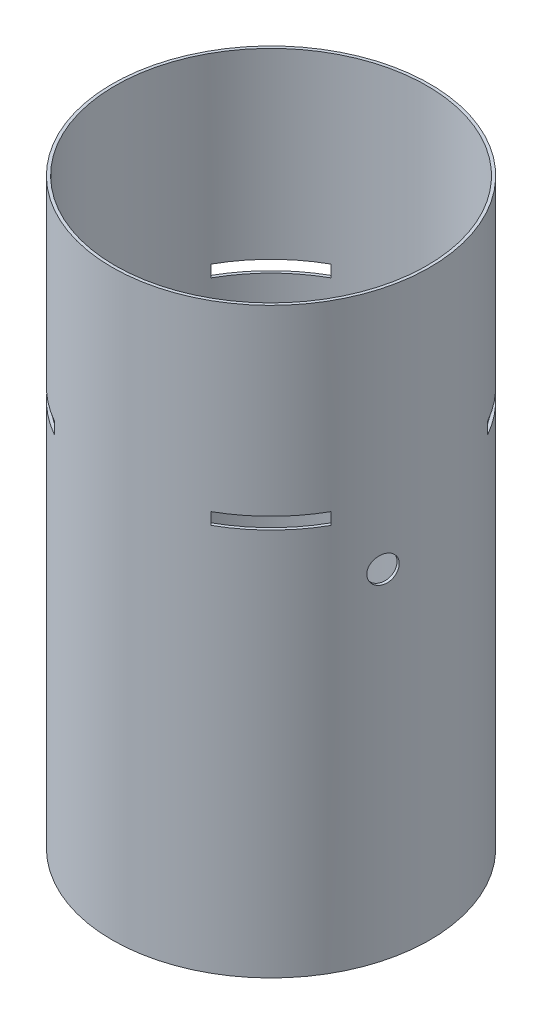
ISO-10303-21;
HEADER;
FILE_DESCRIPTION(('STEP AP214'),'2;1');
FILE_NAME('part.step','',(''),(''),'','','');
FILE_SCHEMA(('AUTOMOTIVE_DESIGN { 1 0 10303 214 1 1 1 1 }'));
ENDSEC;
DATA;
#1=APPLICATION_CONTEXT('core data for automotive mechanical design processes');
#2=APPLICATION_PROTOCOL_DEFINITION('international standard','automotive_design',2000,#1);
#3=PRODUCT_CONTEXT('',#1,'mechanical');
#4=PRODUCT('Part','Part','',(#3));
#5=PRODUCT_RELATED_PRODUCT_CATEGORY('part','',(#4));
#6=PRODUCT_DEFINITION_FORMATION('','',#4);
#7=PRODUCT_DEFINITION_CONTEXT('part definition',#1,'design');
#8=PRODUCT_DEFINITION('design','',#6,#7);
#9=PRODUCT_DEFINITION_SHAPE('','',#8);
#10=(LENGTH_UNIT() NAMED_UNIT(*) SI_UNIT(.MILLI.,.METRE.));
#11=(NAMED_UNIT(*) PLANE_ANGLE_UNIT() SI_UNIT($,.RADIAN.));
#12=(NAMED_UNIT(*) SI_UNIT($,.STERADIAN.) SOLID_ANGLE_UNIT());
#13=UNCERTAINTY_MEASURE_WITH_UNIT(LENGTH_MEASURE(1.E-05),#10,'distance_accuracy_value','');
#14=(GEOMETRIC_REPRESENTATION_CONTEXT(3) GLOBAL_UNCERTAINTY_ASSIGNED_CONTEXT((#13)) GLOBAL_UNIT_ASSIGNED_CONTEXT((#10,
#11,#12)) REPRESENTATION_CONTEXT('',''));
#15=CARTESIAN_POINT('',(0.,0.,0.));
#16=DIRECTION('',(0.,0.,1.));
#17=DIRECTION('',(1.,0.,0.));
#18=AXIS2_PLACEMENT_3D('',#15,#16,#17);
#19=CARTESIAN_POINT('',(0.,139.7,0.));
#20=DIRECTION('',(0.,1.,0.));
#21=DIRECTION('',(0.,0.,1.));
#22=AXIS2_PLACEMENT_3D('',#19,#20,#21);
#23=PLANE('',#22);
#24=CARTESIAN_POINT('',(0.,139.7,0.));
#25=DIRECTION('',(0.,1.,0.));
#26=DIRECTION('',(0.,0.,1.));
#27=AXIS2_PLACEMENT_3D('',#24,#25,#26);
#28=CIRCLE('',#27,76.2);
#29=CARTESIAN_POINT('',(0.,139.7,76.2));
#30=VERTEX_POINT('',#29);
#31=EDGE_CURVE('E293',#30,#30,#28,.T.);
#32=ORIENTED_EDGE('',*,*,#31,.T.);
#33=EDGE_LOOP('',(#32));
#34=FACE_BOUND('',#33,.T.);
#35=CARTESIAN_POINT('',(0.,139.7,0.));
#36=DIRECTION('',(0.,1.,0.));
#37=DIRECTION('',(0.,0.,1.));
#38=AXIS2_PLACEMENT_3D('',#35,#36,#37);
#39=CIRCLE('',#38,74.7776);
#40=CARTESIAN_POINT('',(0.,139.7,74.7776));
#41=VERTEX_POINT('',#40);
#42=EDGE_CURVE('E287',#41,#41,#39,.T.);
#43=ORIENTED_EDGE('',*,*,#42,.F.);
#44=EDGE_LOOP('',(#43));
#45=FACE_BOUND('',#44,.T.);
#46=ADVANCED_FACE('F35',(#34,#45),#23,.T.);
#47=CARTESIAN_POINT('',(0.,-139.7,0.));
#48=DIRECTION('',(0.,1.,0.));
#49=DIRECTION('',(0.,0.,1.));
#50=AXIS2_PLACEMENT_3D('',#47,#48,#49);
#51=PLANE('',#50);
#52=CARTESIAN_POINT('',(0.,-139.7,0.));
#53=DIRECTION('',(0.,1.,0.));
#54=DIRECTION('',(0.,0.,1.));
#55=AXIS2_PLACEMENT_3D('',#52,#53,#54);
#56=CIRCLE('',#55,76.2);
#57=CARTESIAN_POINT('',(0.,-139.7,76.2));
#58=VERTEX_POINT('',#57);
#59=EDGE_CURVE('E290',#58,#58,#56,.T.);
#60=ORIENTED_EDGE('',*,*,#59,.F.);
#61=EDGE_LOOP('',(#60));
#62=FACE_BOUND('',#61,.T.);
#63=CARTESIAN_POINT('',(0.,-139.7,0.));
#64=DIRECTION('',(0.,1.,0.));
#65=DIRECTION('',(0.,0.,1.));
#66=AXIS2_PLACEMENT_3D('',#63,#64,#65);
#67=CIRCLE('',#66,74.7776);
#68=CARTESIAN_POINT('',(0.,-139.7,74.7776));
#69=VERTEX_POINT('',#68);
#70=EDGE_CURVE('E286',#69,#69,#67,.T.);
#71=ORIENTED_EDGE('',*,*,#70,.T.);
#72=EDGE_LOOP('',(#71));
#73=FACE_BOUND('',#72,.T.);
#74=ADVANCED_FACE('F334',(#62,#73),#51,.F.);
#75=CARTESIAN_POINT('',(0.,139.7,0.));
#76=DIRECTION('',(0.,-1.,0.));
#77=DIRECTION('',(0.,0.,-1.));
#78=AXIS2_PLACEMENT_3D('',#75,#76,#77);
#79=CYLINDRICAL_SURFACE('',#78,76.2);
#80=CARTESIAN_POINT('',(74.9910357832042,22.86,13.519783732079));
#81=CARTESIAN_POINT('',(74.9910358402639,22.6819280297353,13.519782090402));
#82=CARTESIAN_POINT('',(74.9897026497337,22.5038810216355,13.5271842263217));
#83=CARTESIAN_POINT('',(74.9843661335385,22.1489977754155,13.556735220421));
#84=CARTESIAN_POINT('',(74.9803621484319,21.9721618472178,13.5788877205875));
#85=CARTESIAN_POINT('',(74.9696695475558,21.6208752943055,13.6377982342823));
#86=CARTESIAN_POINT('',(74.9629787143209,21.4464267631943,13.6745683114973));
#87=CARTESIAN_POINT('',(74.9468950412762,21.1012374874453,13.7624459317439));
#88=CARTESIAN_POINT('',(74.9375012129991,20.930498123836,13.8135587196397));
#89=CARTESIAN_POINT('',(74.916004850316,20.594164134536,13.9296696530872));
#90=CARTESIAN_POINT('',(74.9039048637211,20.4285648354645,13.9946547354603));
#91=CARTESIAN_POINT('',(74.8769675696476,20.1034526296558,14.1380709252443));
#92=CARTESIAN_POINT('',(74.8621292542587,19.9439419901768,14.2165069828681));
#93=CARTESIAN_POINT('',(74.8297111370588,19.6322869636413,14.3861663237595));
#94=CARTESIAN_POINT('',(74.8121329468327,19.4801383147924,14.4773820868793));
#95=CARTESIAN_POINT('',(74.7742106223098,19.1841204108037,14.6719887059059));
#96=CARTESIAN_POINT('',(74.7538654668784,19.0402542403011,14.7753840547336));
#97=CARTESIAN_POINT('',(74.7103707886967,18.7616054554387,14.9937623986853));
#98=CARTESIAN_POINT('',(74.6872159877024,18.6268407018144,15.1087671331046));
#99=CARTESIAN_POINT('',(74.6381354885443,18.3675971910905,15.3493911581652));
#100=CARTESIAN_POINT('',(74.6122087696292,18.2431222533158,15.4750143554367));
#101=CARTESIAN_POINT('',(74.5576297315973,18.0054305687499,15.7358696697887));
#102=CARTESIAN_POINT('',(74.5289783002773,17.8922101792993,15.8710986533934));
#103=CARTESIAN_POINT('',(74.4689832466984,17.6777424409017,16.1502607001277));
#104=CARTESIAN_POINT('',(74.43763863478,17.5764995260645,16.2941969571076));
#105=CARTESIAN_POINT('',(74.372308449198,17.3866517073631,16.5898363854602));
#106=CARTESIAN_POINT('',(74.3383200577136,17.2980605813446,16.7415477834206));
#107=CARTESIAN_POINT('',(74.2678284062168,17.1342501866457,17.051537881023));
#108=CARTESIAN_POINT('',(74.2313242202762,17.059035878112,17.2098189900045));
#109=CARTESIAN_POINT('',(74.1559637007638,16.9225865935057,17.5316948442234));
#110=CARTESIAN_POINT('',(74.1171082743897,16.8613462687066,17.6952875289043));
#111=CARTESIAN_POINT('',(74.0372132089691,16.7532330034018,18.0266528702492));
#112=CARTESIAN_POINT('',(73.9961727711386,16.7063653600969,18.1944270434701));
#113=CARTESIAN_POINT('',(73.8703063732629,16.5881307558746,18.7012874350092));
#114=CARTESIAN_POINT('',(73.7824754851912,16.5386610601558,19.0450262947247));
#115=CARTESIAN_POINT('',(73.6011471000854,16.499979528347,19.7341922847202));
#116=CARTESIAN_POINT('',(73.5076497084596,16.5107665717008,20.0796193834858));
#117=CARTESIAN_POINT('',(73.3179144353622,16.5921009666103,20.7617042350564));
#118=CARTESIAN_POINT('',(73.2216839333448,16.6624998970612,21.0983816289224));
#119=CARTESIAN_POINT('',(73.0294690776816,16.8608498757925,21.7543924115365));
#120=CARTESIAN_POINT('',(72.9334847263866,16.9888014716591,22.0737256352308));
#121=CARTESIAN_POINT('',(72.7451581891624,17.298784562556,22.686669790917));
#122=CARTESIAN_POINT('',(72.6528206401204,17.4808825459815,22.9802485206595));
#123=CARTESIAN_POINT('',(72.4755726348881,17.893942539743,23.5332921473863));
#124=CARTESIAN_POINT('',(72.3906623293987,18.1249055412399,23.7927563522301));
#125=CARTESIAN_POINT('',(72.2316085500085,18.6299757185528,24.2713546576644));
#126=CARTESIAN_POINT('',(72.157498586675,18.9042118985552,24.490363776588));
#127=CARTESIAN_POINT('',(72.0236655528563,19.4875944008328,24.8812060535303));
#128=CARTESIAN_POINT('',(71.9639424942308,19.7967407518855,25.0530391726601));
#129=CARTESIAN_POINT('',(71.8616603685797,20.4412588891374,25.3449365920436));
#130=CARTESIAN_POINT('',(71.8191034186302,20.7766339040018,25.4649945070476));
#131=CARTESIAN_POINT('',(71.7532158948204,21.4640459591348,25.650063226984));
#132=CARTESIAN_POINT('',(71.7298849167552,21.8160826489455,25.7150751891975));
#133=CARTESIAN_POINT('',(71.7036361325607,22.5256927347953,25.788177516094));
#134=CARTESIAN_POINT('',(71.7006572057165,22.8832463179772,25.7964383147106));
#135=CARTESIAN_POINT('',(71.7150972804281,23.5947352819856,25.7562664193095));
#136=CARTESIAN_POINT('',(71.7325160917262,23.9486706965291,25.7078342540892));
#137=CARTESIAN_POINT('',(71.7868558117002,24.6423583599151,25.5556994581878));
#138=CARTESIAN_POINT('',(71.8237486154484,24.982130289027,25.4520764771291));
#139=CARTESIAN_POINT('',(71.9152439197472,25.6384557195783,25.1923903985917));
#140=CARTESIAN_POINT('',(71.9698467044604,25.9550088483643,25.0363264596786));
#141=CARTESIAN_POINT('',(72.0943595527524,26.5567366596692,24.6754877803511));
#142=CARTESIAN_POINT('',(72.1643056687612,26.841835020504,24.4705982141134));
#143=CARTESIAN_POINT('',(72.3162750783604,27.3717888945838,24.017769329695));
#144=CARTESIAN_POINT('',(72.3982985797652,27.6166437152084,23.7698292707355));
#145=CARTESIAN_POINT('',(72.5711121217563,28.0597763895419,23.2368719605676));
#146=CARTESIAN_POINT('',(72.6619234378876,28.2579370034148,22.9517641155922));
#147=CARTESIAN_POINT('',(72.8484449967351,28.6012499292941,22.3526802366635));
#148=CARTESIAN_POINT('',(72.944155190486,28.7464027710057,22.0387044912255));
#149=CARTESIAN_POINT('',(73.1367094364613,28.9793853357991,21.3910202372047));
#150=CARTESIAN_POINT('',(73.2335518960764,29.0672875522433,21.0573372693717));
#151=CARTESIAN_POINT('',(73.4252055395191,29.1834849535822,20.3789857753476));
#152=CARTESIAN_POINT('',(73.520016761762,29.2117812667421,20.0343174572209));
#153=CARTESIAN_POINT('',(73.6582762908082,29.2089774600888,19.5174380912865));
#154=CARTESIAN_POINT('',(73.7036606610809,29.2005318712803,19.3453342619561));
#155=CARTESIAN_POINT('',(73.7928893357992,29.1687284383355,19.0021263984078));
#156=CARTESIAN_POINT('',(73.8367342045398,29.1453761196605,18.8310220174309));
#157=CARTESIAN_POINT('',(73.9226267344647,29.0839103678561,18.4909722343648));
#158=CARTESIAN_POINT('',(73.9646737283076,29.0457915055453,18.3220276499908));
#159=CARTESIAN_POINT('',(74.0467084474198,28.9550886954563,17.9876232219216));
#160=CARTESIAN_POINT('',(74.0866969216768,28.9025100536352,17.8221621239051));
#161=CARTESIAN_POINT('',(74.1644446475905,28.7832408128637,17.4958081379207));
#162=CARTESIAN_POINT('',(74.2022032151661,28.7165459118576,17.3349166595776));
#163=CARTESIAN_POINT('',(74.2753040532381,28.569558528556,17.0189744644724));
#164=CARTESIAN_POINT('',(74.31064720315,28.4892710325313,16.8639216312832));
#165=CARTESIAN_POINT('',(74.3788179631479,28.3156224519297,16.5606643590948));
#166=CARTESIAN_POINT('',(74.4116446963646,28.2222568419132,16.4124623143949));
#167=CARTESIAN_POINT('',(74.4746629017555,28.023170814566,16.1240926630279));
#168=CARTESIAN_POINT('',(74.5048553302727,27.917454913689,15.9839221470376));
#169=CARTESIAN_POINT('',(74.5626463373845,27.6940208928383,15.7121335507389));
#170=CARTESIAN_POINT('',(74.590236126478,27.5762647177504,15.5805448840502));
#171=CARTESIAN_POINT('',(74.642658004102,27.3299156122461,15.3274364381208));
#172=CARTESIAN_POINT('',(74.6674910987217,27.2013266657181,15.2059129895946));
#173=CARTESIAN_POINT('',(74.7144037267937,26.9340985290884,14.9737075905332));
#174=CARTESIAN_POINT('',(74.7364815680302,26.7954532444476,14.8630323115707));
#175=CARTESIAN_POINT('',(74.7778524865882,26.5092121104347,14.6534700592166));
#176=CARTESIAN_POINT('',(74.7971465886721,26.3616195833229,14.5545787502033));
#177=CARTESIAN_POINT('',(74.8330061259466,26.0581360896982,14.3690689911376));
#178=CARTESIAN_POINT('',(74.8495653288949,25.9022272122648,14.282478633365));
#179=CARTESIAN_POINT('',(74.879910628823,25.5835817381058,14.122521444593));
#180=CARTESIAN_POINT('',(74.893697740408,25.4208476659039,14.0491497764842));
#181=CARTESIAN_POINT('',(74.9185141870202,25.0897900518794,13.9162066025271));
#182=CARTESIAN_POINT('',(74.9295458394191,24.9214713426958,13.8566235034604));
#183=CARTESIAN_POINT('',(74.9488822600071,24.5803719107329,13.7516504456804));
#184=CARTESIAN_POINT('',(74.9571877124237,24.407592319316,13.7062569257731));
#185=CARTESIAN_POINT('',(74.9731163728553,24.00797384197,13.6188974874778));
#186=CARTESIAN_POINT('',(74.9798389019519,23.7800250067888,13.5817666486964));
#187=CARTESIAN_POINT('',(74.9887985641436,23.3213701480312,13.5322108674597));
#188=CARTESIAN_POINT('',(74.9910357092923,23.0906641318659,13.5197858586125));
#189=CARTESIAN_POINT('',(74.9910357832042,22.86,13.519783732079));
#190=B_SPLINE_CURVE_WITH_KNOTS('',3,(#80,#81,#82,#83,#84,#85,#86,#87,#88,#89,#90,#91,#92,#93,
#94,#95,#96,#97,#98,#99,#100,#101,#102,#103,#104,#105,#106,#107,#108,#109,#110,#111,#112,#113,
#114,#115,#116,#117,#118,#119,#120,#121,#122,#123,#124,#125,#126,#127,#128,#129,#130,#131,#132,
#133,#134,#135,#136,#137,#138,#139,#140,#141,#142,#143,#144,#145,#146,#147,#148,#149,#150,#151,
#152,#153,#154,#155,#156,#157,#158,#159,#160,#161,#162,#163,#164,#165,#166,#167,#168,#169,#170,
#171,#172,#173,#174,#175,#176,#177,#178,#179,#180,#181,#182,#183,#184,#185,#186,#187,#188,#189),
.UNSPECIFIED.,.T.,.F.,(4,2,2,2,2,2,2,2,2,2,2,2,2,2,2,2,2,2,2,2,2,2,2,2,2,2,2,2,2,2,2,2,2,2,2,2,
2,2,2,2,2,2,2,2,2,2,2,2,2,2,2,2,2,2,4),(0.,0.534014265780221,1.06816043301738,1.60274834198872,
2.1375319952038,2.67181426072716,3.20629357583423,3.74045969025397,4.27482347366641,
4.81020713221177,5.34578862789806,5.88119620838175,6.41680138275325,6.952985456639,
7.48936793584652,8.02554476190678,8.56191896465659,9.63100107910715,10.7000633125863,
11.7664716051261,12.8328900442491,13.9006234249725,14.9683784653054,16.0393789786569,
17.1103803748706,18.1815138160877,19.2526247373339,20.3205175085078,21.3884003191083,
22.4547461546914,23.5211091010023,24.5900050587395,25.6589194110182,26.7304896585072,
27.8020491975326,28.8722492271524,29.9424289990435,30.4764721128003,31.0103173882352,
31.5443591279187,32.0782051640344,32.6122141293487,33.1460276230515,33.6800262914724,
34.2138302863477,34.7493769070152,35.2847274263335,35.8204051446807,36.3558851610426,
36.892569068912,37.4290561876096,37.9650905838781,38.5009903420409,39.1927233972446,
39.884454593553),.UNSPECIFIED.);
#191=CARTESIAN_POINT('',(74.9910357832042,22.86,13.519783732079));
#192=VERTEX_POINT('',#191);
#193=EDGE_CURVE('E465',#192,#192,#190,.T.);
#194=ORIENTED_EDGE('',*,*,#193,.T.);
#195=EDGE_LOOP('',(#194));
#196=FACE_BOUND('',#195,.T.);
#197=DIRECTION('',(0.,-1.,0.));
#198=VECTOR('',#197,1.);
#199=CARTESIAN_POINT('',(37.5620128889523,139.7,66.2988324763731));
#200=LINE('',#199,#198);
#201=CARTESIAN_POINT('',(37.5620128889522,46.355,66.2988324763731));
#202=VERTEX_POINT('',#201);
#203=CARTESIAN_POINT('',(37.5620128889522,52.07,66.2988324763731));
#204=VERTEX_POINT('',#203);
#205=EDGE_CURVE('E256',#202,#204,#200,.F.);
#206=ORIENTED_EDGE('',*,*,#205,.T.);
#207=CARTESIAN_POINT('',(0.,52.07,0.));
#208=DIRECTION('',(0.,1.,0.));
#209=DIRECTION('',(0.,0.,1.));
#210=AXIS2_PLACEMENT_3D('',#207,#208,#209);
#211=CIRCLE('',#210,76.2);
#212=CARTESIAN_POINT('',(66.2988324763734,52.07,37.5620128889517));
#213=VERTEX_POINT('',#212);
#214=EDGE_CURVE('E232',#204,#213,#211,.T.);
#215=ORIENTED_EDGE('',*,*,#214,.T.);
#216=DIRECTION('',(0.,-1.,0.));
#217=VECTOR('',#216,1.);
#218=CARTESIAN_POINT('',(66.2988324763734,139.7,37.5620128889517));
#219=LINE('',#218,#217);
#220=CARTESIAN_POINT('',(66.2988324763734,46.355,37.5620128889517));
#221=VERTEX_POINT('',#220);
#222=EDGE_CURVE('E250',#213,#221,#219,.T.);
#223=ORIENTED_EDGE('',*,*,#222,.T.);
#224=CARTESIAN_POINT('',(0.,46.355,0.));
#225=DIRECTION('',(0.,-1.,0.));
#226=DIRECTION('',(0.,0.,-1.));
#227=AXIS2_PLACEMENT_3D('',#224,#225,#226);
#228=CIRCLE('',#227,76.2);
#229=EDGE_CURVE('E216',#221,#202,#228,.T.);
#230=ORIENTED_EDGE('',*,*,#229,.T.);
#231=EDGE_LOOP('',(#206,#215,#223,#230));
#232=FACE_BOUND('',#231,.T.);
#233=CARTESIAN_POINT('',(37.562012888952,46.355,-66.2988324763733));
#234=VERTEX_POINT('',#233);
#235=CARTESIAN_POINT('',(66.2988324763733,46.355,-37.562012888952));
#236=VERTEX_POINT('',#235);
#237=EDGE_CURVE('E255',#234,#236,#228,.T.);
#238=ORIENTED_EDGE('',*,*,#237,.T.);
#239=DIRECTION('',(0.,-1.,0.));
#240=VECTOR('',#239,1.);
#241=CARTESIAN_POINT('',(66.2988324763732,139.7,-37.5620128889521));
#242=LINE('',#241,#240);
#243=CARTESIAN_POINT('',(66.2988324763733,52.07,-37.562012888952));
#244=VERTEX_POINT('',#243);
#245=EDGE_CURVE('E247',#236,#244,#242,.F.);
#246=ORIENTED_EDGE('',*,*,#245,.T.);
#247=CARTESIAN_POINT('',(37.562012888952,52.07,-66.2988324763733));
#248=VERTEX_POINT('',#247);
#249=EDGE_CURVE('E262',#244,#248,#211,.T.);
#250=ORIENTED_EDGE('',*,*,#249,.T.);
#251=DIRECTION('',(0.,-1.,0.));
#252=VECTOR('',#251,1.);
#253=CARTESIAN_POINT('',(37.562012888952,139.7,-66.2988324763733));
#254=LINE('',#253,#252);
#255=EDGE_CURVE('E236',#248,#234,#254,.T.);
#256=ORIENTED_EDGE('',*,*,#255,.T.);
#257=EDGE_LOOP('',(#238,#246,#250,#256));
#258=FACE_BOUND('',#257,.T.);
#259=DIRECTION('',(0.,-1.,0.));
#260=VECTOR('',#259,1.);
#261=CARTESIAN_POINT('',(-37.5620128889528,139.7,-66.2988324763728));
#262=LINE('',#261,#260);
#263=CARTESIAN_POINT('',(-37.5620128889527,46.355,-66.2988324763729));
#264=VERTEX_POINT('',#263);
#265=CARTESIAN_POINT('',(-37.5620128889528,52.07,-66.2988324763728));
#266=VERTEX_POINT('',#265);
#267=EDGE_CURVE('E233',#264,#266,#262,.F.);
#268=ORIENTED_EDGE('',*,*,#267,.T.);
#269=CARTESIAN_POINT('',(-66.2988324763734,52.07,-37.5620128889517));
#270=VERTEX_POINT('',#269);
#271=EDGE_CURVE('E176',#266,#270,#211,.T.);
#272=ORIENTED_EDGE('',*,*,#271,.T.);
#273=DIRECTION('',(0.,-1.,0.));
#274=VECTOR('',#273,1.);
#275=CARTESIAN_POINT('',(-66.2988324763734,139.7,-37.5620128889518));
#276=LINE('',#275,#274);
#277=CARTESIAN_POINT('',(-66.2988324763734,46.355,-37.5620128889517));
#278=VERTEX_POINT('',#277);
#279=EDGE_CURVE('E258',#270,#278,#276,.T.);
#280=ORIENTED_EDGE('',*,*,#279,.T.);
#281=EDGE_CURVE('E252',#278,#264,#228,.T.);
#282=ORIENTED_EDGE('',*,*,#281,.T.);
#283=EDGE_LOOP('',(#268,#272,#280,#282));
#284=FACE_BOUND('',#283,.T.);
#285=DIRECTION('',(0.,-1.,0.));
#286=VECTOR('',#285,1.);
#287=CARTESIAN_POINT('',(-66.2988324763732,139.7,37.5620128889521));
#288=LINE('',#287,#286);
#289=CARTESIAN_POINT('',(-66.2988324763733,46.355,37.562012888952));
#290=VERTEX_POINT('',#289);
#291=CARTESIAN_POINT('',(-66.2988324763733,52.07,37.562012888952));
#292=VERTEX_POINT('',#291);
#293=EDGE_CURVE('E280',#290,#292,#288,.F.);
#294=ORIENTED_EDGE('',*,*,#293,.T.);
#295=CARTESIAN_POINT('',(0.,52.07,0.));
#296=DIRECTION('',(0.,1.,0.));
#297=DIRECTION('',(0.,0.,1.));
#298=AXIS2_PLACEMENT_3D('',#295,#296,#297);
#299=CIRCLE('',#298,76.2);
#300=CARTESIAN_POINT('',(-37.562012888952,52.07,66.2988324763733));
#301=VERTEX_POINT('',#300);
#302=EDGE_CURVE('E283',#292,#301,#299,.T.);
#303=ORIENTED_EDGE('',*,*,#302,.T.);
#304=DIRECTION('',(0.,-1.,0.));
#305=VECTOR('',#304,1.);
#306=CARTESIAN_POINT('',(-37.562012888952,139.7,66.2988324763733));
#307=LINE('',#306,#305);
#308=CARTESIAN_POINT('',(-37.562012888952,46.355,66.2988324763733));
#309=VERTEX_POINT('',#308);
#310=EDGE_CURVE('E266',#301,#309,#307,.T.);
#311=ORIENTED_EDGE('',*,*,#310,.T.);
#312=CARTESIAN_POINT('',(0.,46.355,0.));
#313=DIRECTION('',(0.,-1.,0.));
#314=DIRECTION('',(0.,0.,-1.));
#315=AXIS2_PLACEMENT_3D('',#312,#313,#314);
#316=CIRCLE('',#315,76.2);
#317=EDGE_CURVE('E277',#309,#290,#316,.T.);
#318=ORIENTED_EDGE('',*,*,#317,.T.);
#319=EDGE_LOOP('',(#294,#303,#311,#318));
#320=FACE_BOUND('',#319,.T.);
#321=ORIENTED_EDGE('',*,*,#31,.F.);
#322=EDGE_LOOP('',(#321));
#323=FACE_BOUND('',#322,.T.);
#324=ORIENTED_EDGE('',*,*,#59,.T.);
#325=EDGE_LOOP('',(#324));
#326=FACE_BOUND('',#325,.T.);
#327=ADVANCED_FACE('F37',(#196,#232,#258,#284,#320,#323,#326),#79,.T.);
#328=CARTESIAN_POINT('',(0.,139.7,0.));
#329=DIRECTION('',(0.,-1.,0.));
#330=DIRECTION('',(0.,0.,-1.));
#331=AXIS2_PLACEMENT_3D('',#328,#329,#330);
#332=CYLINDRICAL_SURFACE('',#331,74.7776);
#333=CARTESIAN_POINT('',(73.6122155851072,22.86,13.1503299734912));
#334=CARTESIAN_POINT('',(73.6122156358364,22.6819408457941,13.1503283168262));
#335=CARTESIAN_POINT('',(73.6108942584394,22.5039068059485,13.1577325077029));
#336=CARTESIAN_POINT('',(73.6056046626355,22.1490495890672,13.1872915474859));
#337=CARTESIAN_POINT('',(73.6016357921813,21.9722267211706,13.2094500302025));
#338=CARTESIAN_POINT('',(73.591035816007,21.6209668192102,13.2683760111798));
#339=CARTESIAN_POINT('',(73.5844025179281,21.4465318725149,13.3051555397513));
#340=CARTESIAN_POINT('',(73.5684547490499,21.1013696948546,13.3930549846881));
#341=CARTESIAN_POINT('',(73.55913929736,20.9306438449538,13.4441801472228));
#342=CARTESIAN_POINT('',(73.5378183099673,20.5943371551486,13.56031780622));
#343=CARTESIAN_POINT('',(73.525815314173,20.4287516244462,13.6253171879294));
#344=CARTESIAN_POINT('',(73.4990880260453,20.1036662104721,13.7687632828766));
#345=CARTESIAN_POINT('',(73.4843627316848,19.9441685942129,13.8472149468737));
#346=CARTESIAN_POINT('',(73.4521834549326,19.6325381547721,14.0169061017682));
#347=CARTESIAN_POINT('',(73.4347310732831,19.4804010792855,14.1081380876567));
#348=CARTESIAN_POINT('',(73.3970698191846,19.1844044959628,14.3027769577185));
#349=CARTESIAN_POINT('',(73.3768599289791,19.0405480724011,14.4061883351921));
#350=CARTESIAN_POINT('',(73.3336399219428,18.7619047305776,14.6246070477006));
#351=CARTESIAN_POINT('',(73.3106243069082,18.627136450831,14.7396370729655));
#352=CARTESIAN_POINT('',(73.2618235616743,18.3678846958092,14.9803119992035));
#353=CARTESIAN_POINT('',(73.2360374111875,18.2434050395244,15.1059608070283));
#354=CARTESIAN_POINT('',(73.1817368234827,18.0057024571114,15.3668670125669));
#355=CARTESIAN_POINT('',(73.1532232743664,17.8924758910492,15.5021212788606));
#356=CARTESIAN_POINT('',(73.0934975022423,17.6779942438523,15.7813329602421));
#357=CARTESIAN_POINT('',(73.06228428718,17.5767435961812,15.9252935687814));
#358=CARTESIAN_POINT('',(72.997204918337,17.3868733662181,16.2209886435832));
#359=CARTESIAN_POINT('',(72.9633357867989,17.2982682848962,16.3727317675674));
#360=CARTESIAN_POINT('',(72.8930686884779,17.1344301431286,16.6827839687296));
#361=CARTESIAN_POINT('',(72.8566697905013,17.0592020433269,16.8410954549525));
#362=CARTESIAN_POINT('',(72.7815027779843,16.9227257356352,17.163029853715));
#363=CARTESIAN_POINT('',(72.7427355783128,16.8614721721717,17.3266507039521));
#364=CARTESIAN_POINT('',(72.6629974690024,16.7533333339971,17.6580694476797));
#365=CARTESIAN_POINT('',(72.622025753482,16.7064533562136,17.8258688564743));
#366=CARTESIAN_POINT('',(72.4963402690409,16.5881908406485,18.3327688905404));
#367=CARTESIAN_POINT('',(72.4085902114106,16.5387022154505,18.6765155465485));
#368=CARTESIAN_POINT('',(72.2273302036263,16.4999793659019,19.3656764608318));
#369=CARTESIAN_POINT('',(72.1338203643116,16.5107439824175,19.7110906868991));
#370=CARTESIAN_POINT('',(71.9439784590771,16.5920264304235,20.3930953088721));
#371=CARTESIAN_POINT('',(71.8476542895407,16.6623901609027,20.7297061552738));
#372=CARTESIAN_POINT('',(71.6551730880771,16.8606547788512,21.385568765911));
#373=CARTESIAN_POINT('',(71.5590160578011,16.9885562315553,21.7048203595795));
#374=CARTESIAN_POINT('',(71.3702795096641,17.2984315867973,22.3176093333716));
#375=CARTESIAN_POINT('',(71.2777047255509,17.480474450186,22.6111132971368));
#376=CARTESIAN_POINT('',(71.0999476803173,17.8934165264475,23.1640103236372));
#377=CARTESIAN_POINT('',(71.0147655750484,18.1243167689732,23.4234026672946));
#378=CARTESIAN_POINT('',(70.8551523233984,18.6292873931068,23.9018996993602));
#379=CARTESIAN_POINT('',(70.7807559579695,18.903491729007,24.1208746470695));
#380=CARTESIAN_POINT('',(70.6463780368827,19.486820372507,24.5116619633362));
#381=CARTESIAN_POINT('',(70.5863964937806,19.7959447105235,24.6834742908124));
#382=CARTESIAN_POINT('',(70.4836535727135,20.4404335137737,24.9753499130401));
#383=CARTESIAN_POINT('',(70.4408944363552,20.7758013879923,25.0954064715885));
#384=CARTESIAN_POINT('',(70.3746822315108,21.4632118851678,25.2804926760576));
#385=CARTESIAN_POINT('',(70.3512287413334,21.8152541437302,25.3455235238999));
#386=CARTESIAN_POINT('',(70.3248300256171,22.5248444987398,25.4186797758822));
#387=CARTESIAN_POINT('',(70.3218210487955,22.8823719923968,25.4269820747747));
#388=CARTESIAN_POINT('',(70.336291535196,23.5938167395654,25.3869255841875));
#389=CARTESIAN_POINT('',(70.3537707998631,23.9477340280304,25.3385673438147));
#390=CARTESIAN_POINT('',(70.4083116443671,24.6413733294498,25.1866144296074));
#391=CARTESIAN_POINT('',(70.4453438813133,24.9811157922362,25.0831025220405));
#392=CARTESIAN_POINT('',(70.5371798258219,25.6373950487937,24.8236691263624));
#393=CARTESIAN_POINT('',(70.5919838292906,25.953931456068,24.6677467655966));
#394=CARTESIAN_POINT('',(70.7169428328694,26.5556704385707,24.3071967481621));
#395=CARTESIAN_POINT('',(70.7871353509309,26.8407938291173,24.1024499462006));
#396=CARTESIAN_POINT('',(70.9396093181463,27.3708124976505,23.6499080336364));
#397=CARTESIAN_POINT('',(71.0218909832411,27.6157070568893,23.4021121540606));
#398=CARTESIAN_POINT('',(71.1952123155935,28.0589570177752,22.869405825529));
#399=CARTESIAN_POINT('',(71.286274044547,28.257190639404,22.5844012112839));
#400=CARTESIAN_POINT('',(71.473251970724,28.6006539608336,21.9854942225347));
#401=CARTESIAN_POINT('',(71.5691681178271,28.7458842077503,21.6715921463603));
#402=CARTESIAN_POINT('',(71.7620615774351,28.9790161985061,21.0240334052114));
#403=CARTESIAN_POINT('',(71.8590373283924,29.0669930892152,20.6904032643126));
#404=CARTESIAN_POINT('',(72.0508737919754,29.1833410239278,20.012119119289));
#405=CARTESIAN_POINT('',(72.1457345462898,29.2117132438308,19.6674653327783));
#406=CARTESIAN_POINT('',(72.2839956305202,29.209021892386,19.1506001661169));
#407=CARTESIAN_POINT('',(72.3293659061061,29.2006153226223,18.978509863451));
#408=CARTESIAN_POINT('',(72.4185448032802,29.1688927851186,18.6353199387358));
#409=CARTESIAN_POINT('',(72.4623539972492,29.1455823426204,18.4642199732533));
#410=CARTESIAN_POINT('',(72.5481544492492,29.084203040033,18.1241700864652));
#411=CARTESIAN_POINT('',(72.5901450325634,29.0461287537276,17.9552209792807));
#412=CARTESIAN_POINT('',(72.6720477958642,28.9555176191279,17.6207987773778));
#413=CARTESIAN_POINT('',(72.7119607316632,28.9029860744799,17.4553244318564));
#414=CARTESIAN_POINT('',(72.7895400926744,28.7838137818592,17.1289365102435));
#415=CARTESIAN_POINT('',(72.8272058421305,28.7171688169473,16.9680243136033));
#416=CARTESIAN_POINT('',(72.9001067206689,28.5702836033914,16.6520325017303));
#417=CARTESIAN_POINT('',(72.9353427341493,28.4900483386212,16.4969507737164));
#418=CARTESIAN_POINT('',(73.0032879351814,28.3165061642789,16.1936277691653));
#419=CARTESIAN_POINT('',(73.03599624035,28.223194721713,16.0453888885649));
#420=CARTESIAN_POINT('',(73.0987697972487,28.0242184803415,15.7569381045524));
#421=CARTESIAN_POINT('',(73.1288360077192,27.9185581952766,15.6167232959299));
#422=CARTESIAN_POINT('',(73.1863732766275,27.695223718658,15.3448234898313));
#423=CARTESIAN_POINT('',(73.2138352243038,27.5775101447339,15.2131689102857));
#424=CARTESIAN_POINT('',(73.2660005118831,27.3312438951086,14.9599245628776));
#425=CARTESIAN_POINT('',(73.2907048579269,27.2026952029612,14.8383311283149));
#426=CARTESIAN_POINT('',(73.3373628275567,26.9355447172036,14.6059826501204));
#427=CARTESIAN_POINT('',(73.359314761352,26.7969368295775,14.4952342736513));
#428=CARTESIAN_POINT('',(73.4004406461651,26.5107669443623,14.2855238776985));
#429=CARTESIAN_POINT('',(73.4196156194975,26.3632082704598,14.1865575231632));
#430=CARTESIAN_POINT('',(73.4552480181452,26.0597797143671,14.0008914307963));
#431=CARTESIAN_POINT('',(73.4716990759403,25.9038914542154,13.9142205010123));
#432=CARTESIAN_POINT('',(73.5018415660837,25.5852818191489,13.7541043161671));
#433=CARTESIAN_POINT('',(73.5155340082128,25.4225629709967,13.6806542227217));
#434=CARTESIAN_POINT('',(73.540177623202,25.0915298937595,13.5475576835333));
#435=CARTESIAN_POINT('',(73.5511310946257,24.9232204916112,13.4878996665771));
#436=CARTESIAN_POINT('',(73.5703300458894,24.5821340966018,13.3827817338937));
#437=CARTESIAN_POINT('',(73.5785762039825,24.4093582344249,13.3373182622006));
#438=CARTESIAN_POINT('',(73.5944039991792,24.0094616090122,13.2497442682751));
#439=CARTESIAN_POINT('',(73.6010863330412,23.7812220842949,13.212501005713));
#440=CARTESIAN_POINT('',(73.6099920868379,23.3219742824879,13.1627949676003));
#441=CARTESIAN_POINT('',(73.6122155193047,23.0909660131817,13.1503321224024));
#442=CARTESIAN_POINT('',(73.6122155851072,22.86,13.1503299734912));
#443=B_SPLINE_CURVE_WITH_KNOTS('',3,(#333,#334,#335,#336,#337,#338,#339,#340,#341,#342,#343,
#344,#345,#346,#347,#348,#349,#350,#351,#352,#353,#354,#355,#356,#357,#358,#359,#360,#361,#362,
#363,#364,#365,#366,#367,#368,#369,#370,#371,#372,#373,#374,#375,#376,#377,#378,#379,#380,#381,
#382,#383,#384,#385,#386,#387,#388,#389,#390,#391,#392,#393,#394,#395,#396,#397,#398,#399,#400,
#401,#402,#403,#404,#405,#406,#407,#408,#409,#410,#411,#412,#413,#414,#415,#416,#417,#418,#419,
#420,#421,#422,#423,#424,#425,#426,#427,#428,#429,#430,#431,#432,#433,#434,#435,#436,#437,#438,
#439,#440,#441,#442),.UNSPECIFIED.,.T.,.F.,(4,2,2,2,2,2,2,2,2,2,2,2,2,2,2,2,2,2,2,2,2,2,2,2,2,2,
2,2,2,2,2,2,2,2,2,2,2,2,2,2,2,2,2,2,2,2,2,2,2,2,2,2,2,2,4),(0.,0.533975546842452,
1.06808265431217,1.6026301419189,2.13737336780301,2.67161334289403,3.20605035463319,
3.74017483350991,4.27449698599046,4.80988357631187,5.34546801029326,5.88087863596366,
6.41648685341004,6.95270441368053,7.48912040901263,8.0253304827207,8.56173792274051,
9.63079012708066,10.6998217653822,11.7660976960698,12.8323841017903,13.9000345142755,
14.9677074293787,16.038750155105,17.1097938137618,18.1809768306193,19.2521364491202,
20.3199543756194,21.3877619538007,22.453971622609,23.5201990451065,24.5890554779566,
25.6579310054421,26.7295659954395,27.8011899234018,28.871404458443,29.9415978797609,
30.4755855412168,31.0093753546631,31.543361540311,32.0771520936091,32.6111023634197,
33.1448572437228,33.6787976155774,34.2125434287153,34.7480924747605,35.2834454768119,
35.8191255557876,36.3546079246239,36.8913249037783,37.4278450613173,37.9639134447496,
38.4998474263165,39.1924855014101,39.8851216297844),.UNSPECIFIED.);
#444=CARTESIAN_POINT('',(73.6122155851072,22.86,13.1503299734912));
#445=VERTEX_POINT('',#444);
#446=EDGE_CURVE('E40',#445,#445,#443,.T.);
#447=ORIENTED_EDGE('',*,*,#446,.F.);
#448=EDGE_LOOP('',(#447));
#449=FACE_BOUND('',#448,.T.);
#450=CARTESIAN_POINT('',(0.,52.07,0.));
#451=DIRECTION('',(0.,1.,0.));
#452=DIRECTION('',(0.,0.,1.));
#453=AXIS2_PLACEMENT_3D('',#450,#451,#452);
#454=CIRCLE('',#453,74.7776);
#455=CARTESIAN_POINT('',(36.5176740689725,52.07,65.2544936563935));
#456=VERTEX_POINT('',#455);
#457=CARTESIAN_POINT('',(65.2544936563937,52.07,36.5176740689721));
#458=VERTEX_POINT('',#457);
#459=EDGE_CURVE('E11',#456,#458,#454,.T.);
#460=ORIENTED_EDGE('',*,*,#459,.F.);
#461=DIRECTION('',(0.,-1.,0.));
#462=VECTOR('',#461,1.);
#463=CARTESIAN_POINT('',(36.5176740689726,139.7,65.2544936563934));
#464=LINE('',#463,#462);
#465=CARTESIAN_POINT('',(36.5176740689725,46.355,65.2544936563934));
#466=VERTEX_POINT('',#465);
#467=EDGE_CURVE('E50',#466,#456,#464,.F.);
#468=ORIENTED_EDGE('',*,*,#467,.F.);
#469=CARTESIAN_POINT('',(0.,46.355,0.));
#470=DIRECTION('',(0.,-1.,0.));
#471=DIRECTION('',(0.,0.,-1.));
#472=AXIS2_PLACEMENT_3D('',#469,#470,#471);
#473=CIRCLE('',#472,74.7776);
#474=CARTESIAN_POINT('',(65.2544936563937,46.355,36.5176740689721));
#475=VERTEX_POINT('',#474);
#476=EDGE_CURVE('E198',#475,#466,#473,.T.);
#477=ORIENTED_EDGE('',*,*,#476,.F.);
#478=DIRECTION('',(0.,-1.,0.));
#479=VECTOR('',#478,1.);
#480=CARTESIAN_POINT('',(65.2544936563937,139.7,36.5176740689721));
#481=LINE('',#480,#479);
#482=EDGE_CURVE('E195',#458,#475,#481,.T.);
#483=ORIENTED_EDGE('',*,*,#482,.F.);
#484=EDGE_LOOP('',(#460,#468,#477,#483));
#485=FACE_BOUND('',#484,.T.);
#486=DIRECTION('',(0.,-1.,0.));
#487=VECTOR('',#486,1.);
#488=CARTESIAN_POINT('',(65.2544936563935,139.7,-36.5176740689724));
#489=LINE('',#488,#487);
#490=CARTESIAN_POINT('',(65.2544936563936,46.355,-36.5176740689723));
#491=VERTEX_POINT('',#490);
#492=CARTESIAN_POINT('',(65.2544936563936,52.07,-36.5176740689723));
#493=VERTEX_POINT('',#492);
#494=EDGE_CURVE('E189',#491,#493,#489,.F.);
#495=ORIENTED_EDGE('',*,*,#494,.F.);
#496=CARTESIAN_POINT('',(36.5176740689723,46.355,-65.2544936563936));
#497=VERTEX_POINT('',#496);
#498=EDGE_CURVE('E185',#497,#491,#473,.T.);
#499=ORIENTED_EDGE('',*,*,#498,.F.);
#500=DIRECTION('',(0.,-1.,0.));
#501=VECTOR('',#500,1.);
#502=CARTESIAN_POINT('',(36.5176740689723,139.7,-65.2544936563936));
#503=LINE('',#502,#501);
#504=CARTESIAN_POINT('',(36.5176740689723,52.07,-65.2544936563936));
#505=VERTEX_POINT('',#504);
#506=EDGE_CURVE('E184',#505,#497,#503,.T.);
#507=ORIENTED_EDGE('',*,*,#506,.F.);
#508=EDGE_CURVE('E52',#493,#505,#454,.T.);
#509=ORIENTED_EDGE('',*,*,#508,.F.);
#510=EDGE_LOOP('',(#495,#499,#507,#509));
#511=FACE_BOUND('',#510,.T.);
#512=CARTESIAN_POINT('',(-36.517674068973,52.07,-65.2544936563932));
#513=VERTEX_POINT('',#512);
#514=CARTESIAN_POINT('',(-65.2544936563937,52.07,-36.517674068972));
#515=VERTEX_POINT('',#514);
#516=EDGE_CURVE('E53',#513,#515,#454,.T.);
#517=ORIENTED_EDGE('',*,*,#516,.F.);
#518=DIRECTION('',(0.,-1.,0.));
#519=VECTOR('',#518,1.);
#520=CARTESIAN_POINT('',(-36.5176740689731,139.7,-65.2544936563932));
#521=LINE('',#520,#519);
#522=CARTESIAN_POINT('',(-36.5176740689731,46.355,-65.2544936563932));
#523=VERTEX_POINT('',#522);
#524=EDGE_CURVE('E157',#523,#513,#521,.F.);
#525=ORIENTED_EDGE('',*,*,#524,.F.);
#526=CARTESIAN_POINT('',(-65.2544936563937,46.355,-36.517674068972));
#527=VERTEX_POINT('',#526);
#528=EDGE_CURVE('E168',#527,#523,#473,.T.);
#529=ORIENTED_EDGE('',*,*,#528,.F.);
#530=DIRECTION('',(0.,-1.,0.));
#531=VECTOR('',#530,1.);
#532=CARTESIAN_POINT('',(-65.2544936563937,139.7,-36.5176740689721));
#533=LINE('',#532,#531);
#534=EDGE_CURVE('E183',#515,#527,#533,.T.);
#535=ORIENTED_EDGE('',*,*,#534,.F.);
#536=EDGE_LOOP('',(#517,#525,#529,#535));
#537=FACE_BOUND('',#536,.T.);
#538=CARTESIAN_POINT('',(0.,52.07,0.));
#539=DIRECTION('',(0.,1.,0.));
#540=DIRECTION('',(0.,0.,1.));
#541=AXIS2_PLACEMENT_3D('',#538,#539,#540);
#542=CIRCLE('',#541,74.7776);
#543=CARTESIAN_POINT('',(-65.2544936563936,52.07,36.5176740689723));
#544=VERTEX_POINT('',#543);
#545=CARTESIAN_POINT('',(-36.5176740689723,52.07,65.2544936563936));
#546=VERTEX_POINT('',#545);
#547=EDGE_CURVE('E169',#544,#546,#542,.T.);
#548=ORIENTED_EDGE('',*,*,#547,.F.);
#549=DIRECTION('',(0.,-1.,0.));
#550=VECTOR('',#549,1.);
#551=CARTESIAN_POINT('',(-65.2544936563935,139.7,36.5176740689724));
#552=LINE('',#551,#550);
#553=CARTESIAN_POINT('',(-65.2544936563936,46.355,36.5176740689723));
#554=VERTEX_POINT('',#553);
#555=EDGE_CURVE('E302',#554,#544,#552,.F.);
#556=ORIENTED_EDGE('',*,*,#555,.F.);
#557=CARTESIAN_POINT('',(0.,46.355,0.));
#558=DIRECTION('',(0.,-1.,0.));
#559=DIRECTION('',(0.,0.,-1.));
#560=AXIS2_PLACEMENT_3D('',#557,#558,#559);
#561=CIRCLE('',#560,74.7776);
#562=CARTESIAN_POINT('',(-36.5176740689723,46.355,65.2544936563936));
#563=VERTEX_POINT('',#562);
#564=EDGE_CURVE('E300',#563,#554,#561,.T.);
#565=ORIENTED_EDGE('',*,*,#564,.F.);
#566=DIRECTION('',(0.,-1.,0.));
#567=VECTOR('',#566,1.);
#568=CARTESIAN_POINT('',(-36.5176740689723,139.7,65.2544936563936));
#569=LINE('',#568,#567);
#570=EDGE_CURVE('E296',#546,#563,#569,.T.);
#571=ORIENTED_EDGE('',*,*,#570,.F.);
#572=EDGE_LOOP('',(#548,#556,#565,#571));
#573=FACE_BOUND('',#572,.T.);
#574=ORIENTED_EDGE('',*,*,#42,.T.);
#575=EDGE_LOOP('',(#574));
#576=FACE_BOUND('',#575,.T.);
#577=ORIENTED_EDGE('',*,*,#70,.F.);
#578=EDGE_LOOP('',(#577));
#579=FACE_BOUND('',#578,.T.);
#580=ADVANCED_FACE('F181',(#449,#485,#511,#537,#573,#576,#579),#332,.F.);
#581=CARTESIAN_POINT('',(-61.8315902062894,52.07,90.5684097937107));
#582=DIRECTION('',(0.,1.,0.));
#583=DIRECTION('',(0.,0.,1.));
#584=AXIS2_PLACEMENT_3D('',#581,#582,#583);
#585=PLANE('',#584);
#586=DIRECTION('',(0.707106781186547,0.,-0.707106781186548));
#587=VECTOR('',#586,1.);
#588=CARTESIAN_POINT('',(-90.5684097937107,52.07,61.8315902062894));
#589=LINE('',#588,#587);
#590=EDGE_CURVE('E263',#292,#544,#589,.T.);
#591=ORIENTED_EDGE('',*,*,#590,.T.);
#592=ORIENTED_EDGE('',*,*,#547,.T.);
#593=DIRECTION('',(0.707106781186547,0.,-0.707106781186548));
#594=VECTOR('',#593,1.);
#595=CARTESIAN_POINT('',(-61.8315902062894,52.07,90.5684097937107));
#596=LINE('',#595,#594);
#597=EDGE_CURVE('E273',#301,#546,#596,.T.);
#598=ORIENTED_EDGE('',*,*,#597,.F.);
#599=ORIENTED_EDGE('',*,*,#302,.F.);
#600=EDGE_LOOP('',(#591,#592,#598,#599));
#601=FACE_BOUND('',#600,.T.);
#602=ADVANCED_FACE('F309',(#601),#585,.F.);
#603=CARTESIAN_POINT('',(-90.5684097937107,52.07,61.8315902062894));
#604=DIRECTION('',(-0.707106781186548,0.,-0.707106781186547));
#605=DIRECTION('',(-0.707106781186547,0.,0.707106781186548));
#606=AXIS2_PLACEMENT_3D('',#603,#604,#605);
#607=PLANE('',#606);
#608=DIRECTION('',(0.707106781186547,0.,-0.707106781186548));
#609=VECTOR('',#608,1.);
#610=CARTESIAN_POINT('',(-90.5684097937107,46.355,61.8315902062894));
#611=LINE('',#610,#609);
#612=EDGE_CURVE('E267',#290,#554,#611,.T.);
#613=ORIENTED_EDGE('',*,*,#612,.T.);
#614=ORIENTED_EDGE('',*,*,#555,.T.);
#615=ORIENTED_EDGE('',*,*,#590,.F.);
#616=ORIENTED_EDGE('',*,*,#293,.F.);
#617=EDGE_LOOP('',(#613,#614,#615,#616));
#618=FACE_BOUND('',#617,.T.);
#619=ADVANCED_FACE('F323',(#618),#607,.F.);
#620=CARTESIAN_POINT('',(-90.5684097937107,46.355,61.8315902062894));
#621=DIRECTION('',(0.,-1.,0.));
#622=DIRECTION('',(0.,0.,-1.));
#623=AXIS2_PLACEMENT_3D('',#620,#621,#622);
#624=PLANE('',#623);
#625=DIRECTION('',(0.707106781186547,0.,-0.707106781186548));
#626=VECTOR('',#625,1.);
#627=CARTESIAN_POINT('',(-61.8315902062894,46.355,90.5684097937107));
#628=LINE('',#627,#626);
#629=EDGE_CURVE('E270',#309,#563,#628,.T.);
#630=ORIENTED_EDGE('',*,*,#629,.T.);
#631=ORIENTED_EDGE('',*,*,#564,.T.);
#632=ORIENTED_EDGE('',*,*,#612,.F.);
#633=ORIENTED_EDGE('',*,*,#317,.F.);
#634=EDGE_LOOP('',(#630,#631,#632,#633));
#635=FACE_BOUND('',#634,.T.);
#636=ADVANCED_FACE('F318',(#635),#624,.F.);
#637=CARTESIAN_POINT('',(-61.8315902062894,46.355,90.5684097937107));
#638=DIRECTION('',(0.707106781186548,0.,0.707106781186547));
#639=DIRECTION('',(0.707106781186547,0.,-0.707106781186548));
#640=AXIS2_PLACEMENT_3D('',#637,#638,#639);
#641=PLANE('',#640);
#642=ORIENTED_EDGE('',*,*,#597,.T.);
#643=ORIENTED_EDGE('',*,*,#570,.T.);
#644=ORIENTED_EDGE('',*,*,#629,.F.);
#645=ORIENTED_EDGE('',*,*,#310,.F.);
#646=EDGE_LOOP('',(#642,#643,#644,#645));
#647=FACE_BOUND('',#646,.T.);
#648=ADVANCED_FACE('F315',(#647),#641,.F.);
#649=CARTESIAN_POINT('',(-61.8315902062903,52.07,-90.56840979371));
#650=DIRECTION('',(0.70710678118654,0.,-0.707106781186555));
#651=DIRECTION('',(-0.707106781186555,0.,-0.70710678118654));
#652=AXIS2_PLACEMENT_3D('',#649,#650,#651);
#653=PLANE('',#652);
#654=DIRECTION('',(0.707106781186555,0.,0.70710678118654));
#655=VECTOR('',#654,1.);
#656=CARTESIAN_POINT('',(-61.8315902062903,46.355,-90.56840979371));
#657=LINE('',#656,#655);
#658=EDGE_CURVE('E163',#264,#523,#657,.T.);
#659=ORIENTED_EDGE('',*,*,#658,.T.);
#660=ORIENTED_EDGE('',*,*,#524,.T.);
#661=DIRECTION('',(0.707106781186555,0.,0.70710678118654));
#662=VECTOR('',#661,1.);
#663=CARTESIAN_POINT('',(-61.8315902062903,52.07,-90.56840979371));
#664=LINE('',#663,#662);
#665=EDGE_CURVE('E160',#266,#513,#664,.T.);
#666=ORIENTED_EDGE('',*,*,#665,.F.);
#667=ORIENTED_EDGE('',*,*,#267,.F.);
#668=EDGE_LOOP('',(#659,#660,#666,#667));
#669=FACE_BOUND('',#668,.T.);
#670=ADVANCED_FACE('F159',(#669),#653,.F.);
#671=CARTESIAN_POINT('',(61.8315902062897,46.355,90.5684097937104));
#672=DIRECTION('',(0.,-1.,0.));
#673=DIRECTION('',(0.,0.,-1.));
#674=AXIS2_PLACEMENT_3D('',#671,#672,#673);
#675=PLANE('',#674);
#676=DIRECTION('',(-0.70710678118655,0.,-0.707106781186545));
#677=VECTOR('',#676,1.);
#678=CARTESIAN_POINT('',(61.8315902062897,46.355,90.5684097937104));
#679=LINE('',#678,#677);
#680=EDGE_CURVE('E218',#527,#278,#679,.T.);
#681=ORIENTED_EDGE('',*,*,#680,.F.);
#682=ORIENTED_EDGE('',*,*,#528,.T.);
#683=ORIENTED_EDGE('',*,*,#658,.F.);
#684=ORIENTED_EDGE('',*,*,#281,.F.);
#685=EDGE_LOOP('',(#681,#682,#683,#684));
#686=FACE_BOUND('',#685,.T.);
#687=ADVANCED_FACE('F350',(#686),#675,.F.);
#688=CARTESIAN_POINT('',(61.8315902062897,52.07,90.5684097937104));
#689=DIRECTION('',(-0.707106781186545,0.,0.70710678118655));
#690=DIRECTION('',(0.70710678118655,0.,0.707106781186545));
#691=AXIS2_PLACEMENT_3D('',#688,#689,#690);
#692=PLANE('',#691);
#693=DIRECTION('',(-0.70710678118655,0.,-0.707106781186545));
#694=VECTOR('',#693,1.);
#695=CARTESIAN_POINT('',(61.8315902062897,52.07,90.5684097937104));
#696=LINE('',#695,#694);
#697=EDGE_CURVE('E234',#515,#270,#696,.T.);
#698=ORIENTED_EDGE('',*,*,#697,.F.);
#699=ORIENTED_EDGE('',*,*,#534,.T.);
#700=ORIENTED_EDGE('',*,*,#680,.T.);
#701=ORIENTED_EDGE('',*,*,#279,.F.);
#702=EDGE_LOOP('',(#698,#699,#700,#701));
#703=FACE_BOUND('',#702,.T.);
#704=ADVANCED_FACE('F355',(#703),#692,.F.);
#705=CARTESIAN_POINT('',(90.5684097937109,52.07,61.8315902062891));
#706=DIRECTION('',(0.,1.,0.));
#707=DIRECTION('',(0.,0.,1.));
#708=AXIS2_PLACEMENT_3D('',#705,#706,#707);
#709=PLANE('',#708);
#710=ORIENTED_EDGE('',*,*,#665,.T.);
#711=ORIENTED_EDGE('',*,*,#516,.T.);
#712=ORIENTED_EDGE('',*,*,#697,.T.);
#713=ORIENTED_EDGE('',*,*,#271,.F.);
#714=EDGE_LOOP('',(#710,#711,#712,#713));
#715=FACE_BOUND('',#714,.T.);
#716=ADVANCED_FACE('F172',(#715),#709,.F.);
#717=CARTESIAN_POINT('',(90.5684097937107,52.07,-61.8315902062894));
#718=DIRECTION('',(0.707106781186548,0.,0.707106781186547));
#719=DIRECTION('',(0.707106781186547,0.,-0.707106781186548));
#720=AXIS2_PLACEMENT_3D('',#717,#718,#719);
#721=PLANE('',#720);
#722=DIRECTION('',(-0.707106781186547,0.,0.707106781186548));
#723=VECTOR('',#722,1.);
#724=CARTESIAN_POINT('',(90.5684097937107,46.355,-61.8315902062894));
#725=LINE('',#724,#723);
#726=EDGE_CURVE('E473',#236,#491,#725,.T.);
#727=ORIENTED_EDGE('',*,*,#726,.T.);
#728=ORIENTED_EDGE('',*,*,#494,.T.);
#729=DIRECTION('',(-0.707106781186547,0.,0.707106781186548));
#730=VECTOR('',#729,1.);
#731=CARTESIAN_POINT('',(90.5684097937107,52.07,-61.8315902062894));
#732=LINE('',#731,#730);
#733=EDGE_CURVE('E243',#244,#493,#732,.T.);
#734=ORIENTED_EDGE('',*,*,#733,.F.);
#735=ORIENTED_EDGE('',*,*,#245,.F.);
#736=EDGE_LOOP('',(#727,#728,#734,#735));
#737=FACE_BOUND('',#736,.T.);
#738=ADVANCED_FACE('F362',(#737),#721,.F.);
#739=CARTESIAN_POINT('',(61.8315902062894,46.355,-90.5684097937107));
#740=DIRECTION('',(-0.707106781186548,0.,-0.707106781186547));
#741=DIRECTION('',(-0.707106781186547,0.,0.707106781186548));
#742=AXIS2_PLACEMENT_3D('',#739,#740,#741);
#743=PLANE('',#742);
#744=DIRECTION('',(-0.707106781186547,0.,0.707106781186548));
#745=VECTOR('',#744,1.);
#746=CARTESIAN_POINT('',(61.8315902062894,52.07,-90.5684097937107));
#747=LINE('',#746,#745);
#748=EDGE_CURVE('E178',#248,#505,#747,.T.);
#749=ORIENTED_EDGE('',*,*,#748,.T.);
#750=ORIENTED_EDGE('',*,*,#506,.T.);
#751=DIRECTION('',(-0.707106781186547,0.,0.707106781186548));
#752=VECTOR('',#751,1.);
#753=CARTESIAN_POINT('',(61.8315902062894,46.355,-90.5684097937107));
#754=LINE('',#753,#752);
#755=EDGE_CURVE('E68',#234,#497,#754,.T.);
#756=ORIENTED_EDGE('',*,*,#755,.F.);
#757=ORIENTED_EDGE('',*,*,#255,.F.);
#758=EDGE_LOOP('',(#749,#750,#756,#757));
#759=FACE_BOUND('',#758,.T.);
#760=ADVANCED_FACE('F365',(#759),#743,.F.);
#761=ORIENTED_EDGE('',*,*,#755,.T.);
#762=ORIENTED_EDGE('',*,*,#498,.T.);
#763=ORIENTED_EDGE('',*,*,#726,.F.);
#764=ORIENTED_EDGE('',*,*,#237,.F.);
#765=EDGE_LOOP('',(#761,#762,#763,#764));
#766=FACE_BOUND('',#765,.T.);
#767=ADVANCED_FACE('F358',(#766),#675,.F.);
#768=ORIENTED_EDGE('',*,*,#733,.T.);
#769=ORIENTED_EDGE('',*,*,#508,.T.);
#770=ORIENTED_EDGE('',*,*,#748,.F.);
#771=ORIENTED_EDGE('',*,*,#249,.F.);
#772=EDGE_LOOP('',(#768,#769,#770,#771));
#773=FACE_BOUND('',#772,.T.);
#774=ADVANCED_FACE('F373',(#773),#709,.F.);
#775=EDGE_CURVE('E226',#204,#456,#696,.T.);
#776=ORIENTED_EDGE('',*,*,#775,.T.);
#777=ORIENTED_EDGE('',*,*,#459,.T.);
#778=DIRECTION('',(-0.70710678118655,0.,-0.707106781186545));
#779=VECTOR('',#778,1.);
#780=CARTESIAN_POINT('',(90.5684097937109,52.07,61.8315902062891));
#781=LINE('',#780,#779);
#782=EDGE_CURVE('E211',#213,#458,#781,.T.);
#783=ORIENTED_EDGE('',*,*,#782,.F.);
#784=ORIENTED_EDGE('',*,*,#214,.F.);
#785=EDGE_LOOP('',(#776,#777,#783,#784));
#786=FACE_BOUND('',#785,.T.);
#787=ADVANCED_FACE('F230',(#786),#709,.F.);
#788=EDGE_CURVE('E228',#202,#466,#679,.T.);
#789=ORIENTED_EDGE('',*,*,#788,.T.);
#790=ORIENTED_EDGE('',*,*,#467,.T.);
#791=ORIENTED_EDGE('',*,*,#775,.F.);
#792=ORIENTED_EDGE('',*,*,#205,.F.);
#793=EDGE_LOOP('',(#789,#790,#791,#792));
#794=FACE_BOUND('',#793,.T.);
#795=ADVANCED_FACE('F225',(#794),#692,.F.);
#796=DIRECTION('',(-0.70710678118655,0.,-0.707106781186545));
#797=VECTOR('',#796,1.);
#798=CARTESIAN_POINT('',(90.5684097937109,46.355,61.8315902062891));
#799=LINE('',#798,#797);
#800=EDGE_CURVE('E60',#221,#475,#799,.T.);
#801=ORIENTED_EDGE('',*,*,#800,.T.);
#802=ORIENTED_EDGE('',*,*,#476,.T.);
#803=ORIENTED_EDGE('',*,*,#788,.F.);
#804=ORIENTED_EDGE('',*,*,#229,.F.);
#805=EDGE_LOOP('',(#801,#802,#803,#804));
#806=FACE_BOUND('',#805,.T.);
#807=ADVANCED_FACE('F214',(#806),#675,.F.);
#808=CARTESIAN_POINT('',(90.5684097937109,46.355,61.8315902062891));
#809=DIRECTION('',(0.707106781186545,0.,-0.70710678118655));
#810=DIRECTION('',(-0.70710678118655,0.,-0.707106781186545));
#811=AXIS2_PLACEMENT_3D('',#808,#809,#810);
#812=PLANE('',#811);
#813=ORIENTED_EDGE('',*,*,#782,.T.);
#814=ORIENTED_EDGE('',*,*,#482,.T.);
#815=ORIENTED_EDGE('',*,*,#800,.F.);
#816=ORIENTED_EDGE('',*,*,#222,.F.);
#817=EDGE_LOOP('',(#813,#814,#815,#816));
#818=FACE_BOUND('',#817,.T.);
#819=ADVANCED_FACE('F209',(#818),#812,.F.);
#820=CARTESIAN_POINT('',(68.843851861605,22.86,18.4466545101649));
#821=DIRECTION('',(0.965925826289068,0.,0.258819045102521));
#822=DIRECTION('',(0.258819045102521,0.,-0.965925826289068));
#823=AXIS2_PLACEMENT_3D('',#820,#821,#822);
#824=CYLINDRICAL_SURFACE('',#823,6.35);
#825=ORIENTED_EDGE('',*,*,#446,.T.);
#826=EDGE_LOOP('',(#825));
#827=FACE_BOUND('',#826,.T.);
#828=ORIENTED_EDGE('',*,*,#193,.F.);
#829=EDGE_LOOP('',(#828));
#830=FACE_BOUND('',#829,.T.);
#831=ADVANCED_FACE('F360',(#827,#830),#824,.F.);
#832=CLOSED_SHELL('',(#46,#74,#327,#580,#602,#619,#636,#648,#670,#687,#704,#716,#738,#760,#767,
#774,#787,#795,#807,#819,#831));
#833=MANIFOLD_SOLID_BREP('B2',#832);
#834=ADVANCED_BREP_SHAPE_REPRESENTATION('',(#18,#833),#14);
#835=SHAPE_DEFINITION_REPRESENTATION(#9,#834);
ENDSEC;
END-ISO-10303-21;
